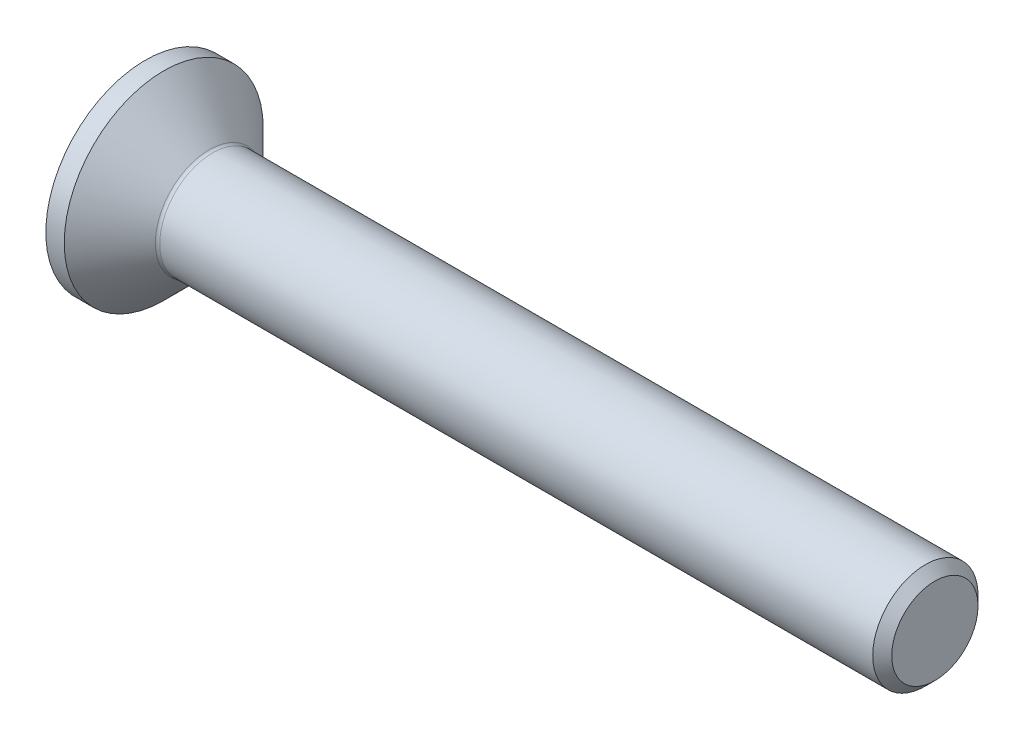
ISO-10303-21;
HEADER;
FILE_DESCRIPTION(('STEP AP214'),'2;1');
FILE_NAME('part.step','',(''),(''),'','','');
FILE_SCHEMA(('AUTOMOTIVE_DESIGN { 1 0 10303 214 1 1 1 1 }'));
ENDSEC;
DATA;
#1=APPLICATION_CONTEXT('core data for automotive mechanical design processes');
#2=APPLICATION_PROTOCOL_DEFINITION('international standard','automotive_design',2000,#1);
#3=PRODUCT_CONTEXT('',#1,'mechanical');
#4=PRODUCT('Part','Part','',(#3));
#5=PRODUCT_RELATED_PRODUCT_CATEGORY('part','',(#4));
#6=PRODUCT_DEFINITION_FORMATION('','',#4);
#7=PRODUCT_DEFINITION_CONTEXT('part definition',#1,'design');
#8=PRODUCT_DEFINITION('design','',#6,#7);
#9=PRODUCT_DEFINITION_SHAPE('','',#8);
#10=(LENGTH_UNIT() NAMED_UNIT(*) SI_UNIT(.MILLI.,.METRE.));
#11=(NAMED_UNIT(*) PLANE_ANGLE_UNIT() SI_UNIT($,.RADIAN.));
#12=(NAMED_UNIT(*) SI_UNIT($,.STERADIAN.) SOLID_ANGLE_UNIT());
#13=UNCERTAINTY_MEASURE_WITH_UNIT(LENGTH_MEASURE(1.E-05),#10,'distance_accuracy_value','');
#14=(GEOMETRIC_REPRESENTATION_CONTEXT(3) GLOBAL_UNCERTAINTY_ASSIGNED_CONTEXT((#13)) GLOBAL_UNIT_ASSIGNED_CONTEXT((#10,
#11,#12)) REPRESENTATION_CONTEXT('',''));
#15=CARTESIAN_POINT('',(0.,0.,0.));
#16=DIRECTION('',(0.,0.,1.));
#17=DIRECTION('',(1.,0.,0.));
#18=AXIS2_PLACEMENT_3D('',#15,#16,#17);
#19=CARTESIAN_POINT('',(3.72,0.,0.));
#20=DIRECTION('',(-1.,0.,0.));
#21=DIRECTION('',(0.,0.,1.));
#22=AXIS2_PLACEMENT_3D('',#19,#20,#21);
#23=CONICAL_SURFACE('',#22,3.,0.785398163397448);
#24=CARTESIAN_POINT('',(1.05,0.,0.));
#25=DIRECTION('',(-1.,0.,0.));
#26=DIRECTION('',(0.,0.,1.));
#27=AXIS2_PLACEMENT_3D('',#24,#25,#26);
#28=CIRCLE('',#27,5.67);
#29=CARTESIAN_POINT('',(1.05,0.,5.67));
#30=VERTEX_POINT('',#29);
#31=EDGE_CURVE('E43',#30,#30,#28,.F.);
#32=ORIENTED_EDGE('',*,*,#31,.T.);
#33=EDGE_LOOP('',(#32));
#34=FACE_BOUND('',#33,.T.);
#35=CARTESIAN_POINT('',(3.64677669529664,0.,0.));
#36=DIRECTION('',(-1.,0.,0.));
#37=DIRECTION('',(0.,0.,1.));
#38=AXIS2_PLACEMENT_3D('',#35,#36,#37);
#39=CIRCLE('',#38,3.07322330470336);
#40=CARTESIAN_POINT('',(3.64677669529664,0.,3.07322330470336));
#41=VERTEX_POINT('',#40);
#42=EDGE_CURVE('E162',#41,#41,#39,.T.);
#43=ORIENTED_EDGE('',*,*,#42,.T.);
#44=EDGE_LOOP('',(#43));
#45=FACE_BOUND('',#44,.T.);
#46=ADVANCED_FACE('F39',(#34,#45),#23,.T.);
#47=CARTESIAN_POINT('',(-0.587069180985524,0.,0.));
#48=DIRECTION('',(-1.,0.,0.));
#49=DIRECTION('',(0.,0.,1.));
#50=AXIS2_PLACEMENT_3D('',#47,#48,#49);
#51=CYLINDRICAL_SURFACE('',#50,3.);
#52=CARTESIAN_POINT('',(44.4585,0.,0.));
#53=DIRECTION('',(-1.,0.,0.));
#54=DIRECTION('',(0.,0.,1.));
#55=AXIS2_PLACEMENT_3D('',#52,#53,#54);
#56=CIRCLE('',#55,3.);
#57=CARTESIAN_POINT('',(44.4585,0.,3.));
#58=VERTEX_POINT('',#57);
#59=EDGE_CURVE('E48',#58,#58,#56,.T.);
#60=ORIENTED_EDGE('',*,*,#59,.T.);
#61=EDGE_LOOP('',(#60));
#62=FACE_BOUND('',#61,.T.);
#63=CARTESIAN_POINT('',(3.82355339059328,0.,0.));
#64=DIRECTION('',(-1.,0.,0.));
#65=DIRECTION('',(0.,0.,1.));
#66=AXIS2_PLACEMENT_3D('',#63,#64,#65);
#67=CIRCLE('',#66,3.);
#68=CARTESIAN_POINT('',(3.82355339059328,0.,3.));
#69=VERTEX_POINT('',#68);
#70=EDGE_CURVE('E159',#69,#69,#67,.F.);
#71=ORIENTED_EDGE('',*,*,#70,.T.);
#72=EDGE_LOOP('',(#71));
#73=FACE_BOUND('',#72,.T.);
#74=ADVANCED_FACE('F130',(#62,#73),#51,.T.);
#75=CARTESIAN_POINT('',(45.,3.,0.));
#76=DIRECTION('',(-1.,0.,0.));
#77=DIRECTION('',(0.,0.,1.));
#78=AXIS2_PLACEMENT_3D('',#75,#76,#77);
#79=PLANE('',#78);
#80=CARTESIAN_POINT('',(45.,0.,0.));
#81=DIRECTION('',(-1.,0.,0.));
#82=DIRECTION('',(0.,0.,1.));
#83=AXIS2_PLACEMENT_3D('',#80,#81,#82);
#84=CIRCLE('',#83,2.45849999999999);
#85=CARTESIAN_POINT('',(45.,0.,2.45849999999999));
#86=VERTEX_POINT('',#85);
#87=EDGE_CURVE('E11',#86,#86,#84,.F.);
#88=ORIENTED_EDGE('',*,*,#87,.T.);
#89=EDGE_LOOP('',(#88));
#90=FACE_BOUND('',#89,.T.);
#91=ADVANCED_FACE('F136',(#90),#79,.F.);
#92=CARTESIAN_POINT('',(3.82355339059328,0.,0.));
#93=DIRECTION('',(-1.,0.,0.));
#94=DIRECTION('',(0.,0.,1.));
#95=AXIS2_PLACEMENT_3D('',#92,#93,#94);
#96=TOROIDAL_SURFACE('',#95,3.25,0.25);
#97=ORIENTED_EDGE('',*,*,#70,.F.);
#98=EDGE_LOOP('',(#97));
#99=FACE_BOUND('',#98,.T.);
#100=ORIENTED_EDGE('',*,*,#42,.F.);
#101=EDGE_LOOP('',(#100));
#102=FACE_BOUND('',#101,.T.);
#103=ADVANCED_FACE('F147',(#99,#102),#96,.F.);
#104=CARTESIAN_POINT('',(44.4585,0.,0.));
#105=DIRECTION('',(-1.,0.,0.));
#106=DIRECTION('',(0.,0.,1.));
#107=AXIS2_PLACEMENT_3D('',#104,#105,#106);
#108=CONICAL_SURFACE('',#107,3.,0.785398163397444);
#109=ORIENTED_EDGE('',*,*,#87,.F.);
#110=EDGE_LOOP('',(#109));
#111=FACE_BOUND('',#110,.T.);
#112=ORIENTED_EDGE('',*,*,#59,.F.);
#113=EDGE_LOOP('',(#112));
#114=FACE_BOUND('',#113,.T.);
#115=ADVANCED_FACE('F41',(#111,#114),#108,.T.);
#116=CARTESIAN_POINT('',(11.8531386861314,0.,0.));
#117=DIRECTION('',(1.,0.,0.));
#118=DIRECTION('',(0.,0.,-1.));
#119=AXIS2_PLACEMENT_3D('',#116,#117,#118);
#120=CYLINDRICAL_SURFACE('',#119,5.67);
#121=ORIENTED_EDGE('',*,*,#31,.F.);
#122=EDGE_LOOP('',(#121));
#123=FACE_BOUND('',#122,.T.);
#124=CARTESIAN_POINT('',(0.,0.,0.));
#125=DIRECTION('',(1.,0.,0.));
#126=DIRECTION('',(0.,0.,-1.));
#127=AXIS2_PLACEMENT_3D('',#124,#125,#126);
#128=CIRCLE('',#127,5.67);
#129=CARTESIAN_POINT('',(0.,0.,-5.67));
#130=VERTEX_POINT('',#129);
#131=EDGE_CURVE('E228',#130,#130,#128,.F.);
#132=ORIENTED_EDGE('',*,*,#131,.F.);
#133=EDGE_LOOP('',(#132));
#134=FACE_BOUND('',#133,.T.);
#135=ADVANCED_FACE('F117',(#123,#134),#120,.T.);
#136=CARTESIAN_POINT('',(3.35470053837925,0.,0.));
#137=DIRECTION('',(-1.,0.,0.));
#138=DIRECTION('',(0.,0.,1.));
#139=AXIS2_PLACEMENT_3D('',#136,#137,#138);
#140=CONICAL_SURFACE('',#139,0.,1.0471975511966);
#141=CARTESIAN_POINT('',(2.2,0.,0.));
#142=DIRECTION('',(-1.,0.,0.));
#143=DIRECTION('',(0.,0.,1.));
#144=AXIS2_PLACEMENT_3D('',#141,#142,#143);
#145=CIRCLE('',#144,2.);
#146=CARTESIAN_POINT('',(2.2,1.,1.73205080756888));
#147=VERTEX_POINT('',#146);
#148=CARTESIAN_POINT('',(2.2,2.,0.));
#149=VERTEX_POINT('',#148);
#150=EDGE_CURVE('E168',#147,#149,#145,.T.);
#151=ORIENTED_EDGE('',*,*,#150,.T.);
#152=CARTESIAN_POINT('',(2.2,1.,-1.73205080756888));
#153=VERTEX_POINT('',#152);
#154=EDGE_CURVE('E163',#149,#153,#145,.T.);
#155=ORIENTED_EDGE('',*,*,#154,.T.);
#156=CARTESIAN_POINT('',(2.2,-1.,-1.73205080756888));
#157=VERTEX_POINT('',#156);
#158=EDGE_CURVE('E166',#153,#157,#145,.T.);
#159=ORIENTED_EDGE('',*,*,#158,.T.);
#160=CARTESIAN_POINT('',(2.2,-2.,0.));
#161=VERTEX_POINT('',#160);
#162=EDGE_CURVE('E247',#157,#161,#145,.T.);
#163=ORIENTED_EDGE('',*,*,#162,.T.);
#164=CARTESIAN_POINT('',(2.2,-1.,1.73205080756888));
#165=VERTEX_POINT('',#164);
#166=EDGE_CURVE('E55',#161,#165,#145,.T.);
#167=ORIENTED_EDGE('',*,*,#166,.T.);
#168=EDGE_CURVE('E177',#165,#147,#145,.T.);
#169=ORIENTED_EDGE('',*,*,#168,.T.);
#170=EDGE_LOOP('',(#151,#155,#159,#163,#167,#169));
#171=FACE_BOUND('',#170,.T.);
#172=CARTESIAN_POINT('',(3.35470053837925,0.,0.));
#173=VERTEX_POINT('',#172);
#174=VERTEX_LOOP('',#173);
#175=FACE_BOUND('',#174,.T.);
#176=ADVANCED_FACE('F114',(#171,#175),#140,.F.);
#177=CARTESIAN_POINT('',(2.2,0.,-2.3094010767585));
#178=DIRECTION('',(1.,0.,0.));
#179=DIRECTION('',(0.,0.,-1.));
#180=AXIS2_PLACEMENT_3D('',#177,#178,#179);
#181=PLANE('',#180);
#182=ORIENTED_EDGE('',*,*,#166,.F.);
#183=DIRECTION('',(0.,0.,-1.));
#184=VECTOR('',#183,1.);
#185=CARTESIAN_POINT('',(2.2,-2.,1.15470053837925));
#186=LINE('',#185,#184);
#187=CARTESIAN_POINT('',(2.2,-2.,1.15470053837925));
#188=VERTEX_POINT('',#187);
#189=EDGE_CURVE('E188',#188,#161,#186,.T.);
#190=ORIENTED_EDGE('',*,*,#189,.F.);
#191=DIRECTION('',(0.,-0.866025403784439,-0.5));
#192=VECTOR('',#191,1.);
#193=CARTESIAN_POINT('',(2.2,0.,2.3094010767585));
#194=LINE('',#193,#192);
#195=EDGE_CURVE('E212',#165,#188,#194,.T.);
#196=ORIENTED_EDGE('',*,*,#195,.F.);
#197=EDGE_LOOP('',(#182,#190,#196));
#198=FACE_BOUND('',#197,.T.);
#199=ADVANCED_FACE('F116',(#198),#181,.F.);
#200=ORIENTED_EDGE('',*,*,#168,.F.);
#201=CARTESIAN_POINT('',(2.2,0.,2.3094010767585));
#202=VERTEX_POINT('',#201);
#203=EDGE_CURVE('E209',#202,#165,#194,.T.);
#204=ORIENTED_EDGE('',*,*,#203,.F.);
#205=DIRECTION('',(0.,-0.866025403784438,0.5));
#206=VECTOR('',#205,1.);
#207=CARTESIAN_POINT('',(2.2,2.,1.15470053837925));
#208=LINE('',#207,#206);
#209=EDGE_CURVE('E216',#147,#202,#208,.T.);
#210=ORIENTED_EDGE('',*,*,#209,.F.);
#211=EDGE_LOOP('',(#200,#204,#210));
#212=FACE_BOUND('',#211,.T.);
#213=ADVANCED_FACE('F123',(#212),#181,.F.);
#214=ORIENTED_EDGE('',*,*,#150,.F.);
#215=CARTESIAN_POINT('',(2.2,2.,1.15470053837925));
#216=VERTEX_POINT('',#215);
#217=EDGE_CURVE('E213',#216,#147,#208,.T.);
#218=ORIENTED_EDGE('',*,*,#217,.F.);
#219=DIRECTION('',(0.,0.,1.));
#220=VECTOR('',#219,1.);
#221=CARTESIAN_POINT('',(2.2,2.,-1.15470053837925));
#222=LINE('',#221,#220);
#223=EDGE_CURVE('E220',#149,#216,#222,.T.);
#224=ORIENTED_EDGE('',*,*,#223,.F.);
#225=EDGE_LOOP('',(#214,#218,#224));
#226=FACE_BOUND('',#225,.T.);
#227=ADVANCED_FACE('F278',(#226),#181,.F.);
#228=ORIENTED_EDGE('',*,*,#154,.F.);
#229=CARTESIAN_POINT('',(2.2,2.,-1.15470053837925));
#230=VERTEX_POINT('',#229);
#231=EDGE_CURVE('E217',#230,#149,#222,.T.);
#232=ORIENTED_EDGE('',*,*,#231,.F.);
#233=DIRECTION('',(0.,0.866025403784438,0.5));
#234=VECTOR('',#233,1.);
#235=CARTESIAN_POINT('',(2.2,0.,-2.3094010767585));
#236=LINE('',#235,#234);
#237=EDGE_CURVE('E224',#153,#230,#236,.T.);
#238=ORIENTED_EDGE('',*,*,#237,.F.);
#239=EDGE_LOOP('',(#228,#232,#238));
#240=FACE_BOUND('',#239,.T.);
#241=ADVANCED_FACE('F283',(#240),#181,.F.);
#242=ORIENTED_EDGE('',*,*,#158,.F.);
#243=CARTESIAN_POINT('',(2.2,0.,-2.3094010767585));
#244=VERTEX_POINT('',#243);
#245=EDGE_CURVE('E221',#244,#153,#236,.T.);
#246=ORIENTED_EDGE('',*,*,#245,.F.);
#247=DIRECTION('',(0.,0.866025403784439,-0.5));
#248=VECTOR('',#247,1.);
#249=CARTESIAN_POINT('',(2.2,-2.,-1.15470053837925));
#250=LINE('',#249,#248);
#251=EDGE_CURVE('E192',#157,#244,#250,.T.);
#252=ORIENTED_EDGE('',*,*,#251,.F.);
#253=EDGE_LOOP('',(#242,#246,#252));
#254=FACE_BOUND('',#253,.T.);
#255=ADVANCED_FACE('F252',(#254),#181,.F.);
#256=ORIENTED_EDGE('',*,*,#162,.F.);
#257=CARTESIAN_POINT('',(2.2,-2.,-1.15470053837925));
#258=VERTEX_POINT('',#257);
#259=EDGE_CURVE('E225',#258,#157,#250,.T.);
#260=ORIENTED_EDGE('',*,*,#259,.F.);
#261=EDGE_CURVE('E208',#161,#258,#186,.T.);
#262=ORIENTED_EDGE('',*,*,#261,.F.);
#263=EDGE_LOOP('',(#256,#260,#262));
#264=FACE_BOUND('',#263,.T.);
#265=ADVANCED_FACE('F126',(#264),#181,.F.);
#266=CARTESIAN_POINT('',(2.2,-2.,1.15470053837925));
#267=DIRECTION('',(0.,1.,0.));
#268=DIRECTION('',(0.,0.,1.));
#269=AXIS2_PLACEMENT_3D('',#266,#267,#268);
#270=PLANE('',#269);
#271=DIRECTION('',(0.,0.,-1.));
#272=VECTOR('',#271,1.);
#273=CARTESIAN_POINT('',(0.,-2.,1.15470053837925));
#274=LINE('',#273,#272);
#275=CARTESIAN_POINT('',(0.,-2.,1.15470053837925));
#276=VERTEX_POINT('',#275);
#277=CARTESIAN_POINT('',(0.,-2.,-1.15470053837925));
#278=VERTEX_POINT('',#277);
#279=EDGE_CURVE('E189',#276,#278,#274,.T.);
#280=ORIENTED_EDGE('',*,*,#279,.F.);
#281=DIRECTION('',(-1.,0.,0.));
#282=VECTOR('',#281,1.);
#283=CARTESIAN_POINT('',(2.2,-2.,1.15470053837925));
#284=LINE('',#283,#282);
#285=EDGE_CURVE('E184',#188,#276,#284,.T.);
#286=ORIENTED_EDGE('',*,*,#285,.F.);
#287=ORIENTED_EDGE('',*,*,#189,.T.);
#288=ORIENTED_EDGE('',*,*,#261,.T.);
#289=DIRECTION('',(-1.,0.,0.));
#290=VECTOR('',#289,1.);
#291=CARTESIAN_POINT('',(2.2,-2.,-1.15470053837925));
#292=LINE('',#291,#290);
#293=EDGE_CURVE('E186',#258,#278,#292,.T.);
#294=ORIENTED_EDGE('',*,*,#293,.T.);
#295=EDGE_LOOP('',(#280,#286,#287,#288,#294));
#296=FACE_BOUND('',#295,.T.);
#297=ADVANCED_FACE('F241',(#296),#270,.T.);
#298=CARTESIAN_POINT('',(2.2,0.,2.3094010767585));
#299=DIRECTION('',(0.,0.5,-0.866025403784438));
#300=DIRECTION('',(0.,0.866025403784439,0.5));
#301=AXIS2_PLACEMENT_3D('',#298,#299,#300);
#302=PLANE('',#301);
#303=DIRECTION('',(0.,-0.866025403784439,-0.5));
#304=VECTOR('',#303,1.);
#305=CARTESIAN_POINT('',(0.,0.,2.3094010767585));
#306=LINE('',#305,#304);
#307=CARTESIAN_POINT('',(0.,0.,2.3094010767585));
#308=VERTEX_POINT('',#307);
#309=EDGE_CURVE('E193',#308,#276,#306,.T.);
#310=ORIENTED_EDGE('',*,*,#309,.F.);
#311=DIRECTION('',(-1.,0.,0.));
#312=VECTOR('',#311,1.);
#313=CARTESIAN_POINT('',(2.2,0.,2.3094010767585));
#314=LINE('',#313,#312);
#315=EDGE_CURVE('E182',#202,#308,#314,.T.);
#316=ORIENTED_EDGE('',*,*,#315,.F.);
#317=ORIENTED_EDGE('',*,*,#203,.T.);
#318=ORIENTED_EDGE('',*,*,#195,.T.);
#319=ORIENTED_EDGE('',*,*,#285,.T.);
#320=EDGE_LOOP('',(#310,#316,#317,#318,#319));
#321=FACE_BOUND('',#320,.T.);
#322=ADVANCED_FACE('F271',(#321),#302,.T.);
#323=CARTESIAN_POINT('',(2.2,2.,1.15470053837925));
#324=DIRECTION('',(0.,-0.5,-0.866025403784439));
#325=DIRECTION('',(0.,0.866025403784438,-0.5));
#326=AXIS2_PLACEMENT_3D('',#323,#324,#325);
#327=PLANE('',#326);
#328=DIRECTION('',(0.,-0.866025403784438,0.5));
#329=VECTOR('',#328,1.);
#330=CARTESIAN_POINT('',(0.,2.,1.15470053837925));
#331=LINE('',#330,#329);
#332=CARTESIAN_POINT('',(0.,2.,1.15470053837925));
#333=VERTEX_POINT('',#332);
#334=EDGE_CURVE('E196',#333,#308,#331,.T.);
#335=ORIENTED_EDGE('',*,*,#334,.F.);
#336=DIRECTION('',(-1.,0.,0.));
#337=VECTOR('',#336,1.);
#338=CARTESIAN_POINT('',(2.2,2.,1.15470053837925));
#339=LINE('',#338,#337);
#340=EDGE_CURVE('E180',#216,#333,#339,.T.);
#341=ORIENTED_EDGE('',*,*,#340,.F.);
#342=ORIENTED_EDGE('',*,*,#217,.T.);
#343=ORIENTED_EDGE('',*,*,#209,.T.);
#344=ORIENTED_EDGE('',*,*,#315,.T.);
#345=EDGE_LOOP('',(#335,#341,#342,#343,#344));
#346=FACE_BOUND('',#345,.T.);
#347=ADVANCED_FACE('F265',(#346),#327,.T.);
#348=CARTESIAN_POINT('',(2.2,2.,-1.15470053837925));
#349=DIRECTION('',(0.,-1.,0.));
#350=DIRECTION('',(0.,0.,-1.));
#351=AXIS2_PLACEMENT_3D('',#348,#349,#350);
#352=PLANE('',#351);
#353=DIRECTION('',(0.,0.,1.));
#354=VECTOR('',#353,1.);
#355=CARTESIAN_POINT('',(0.,2.,-1.15470053837925));
#356=LINE('',#355,#354);
#357=CARTESIAN_POINT('',(0.,2.,-1.15470053837925));
#358=VERTEX_POINT('',#357);
#359=EDGE_CURVE('E199',#358,#333,#356,.T.);
#360=ORIENTED_EDGE('',*,*,#359,.F.);
#361=DIRECTION('',(-1.,0.,0.));
#362=VECTOR('',#361,1.);
#363=CARTESIAN_POINT('',(2.2,2.,-1.15470053837925));
#364=LINE('',#363,#362);
#365=EDGE_CURVE('E178',#230,#358,#364,.T.);
#366=ORIENTED_EDGE('',*,*,#365,.F.);
#367=ORIENTED_EDGE('',*,*,#231,.T.);
#368=ORIENTED_EDGE('',*,*,#223,.T.);
#369=ORIENTED_EDGE('',*,*,#340,.T.);
#370=EDGE_LOOP('',(#360,#366,#367,#368,#369));
#371=FACE_BOUND('',#370,.T.);
#372=ADVANCED_FACE('F261',(#371),#352,.T.);
#373=CARTESIAN_POINT('',(2.2,0.,-2.3094010767585));
#374=DIRECTION('',(0.,-0.5,0.866025403784438));
#375=DIRECTION('',(0.,-0.866025403784438,-0.5));
#376=AXIS2_PLACEMENT_3D('',#373,#374,#375);
#377=PLANE('',#376);
#378=DIRECTION('',(0.,0.866025403784438,0.5));
#379=VECTOR('',#378,1.);
#380=CARTESIAN_POINT('',(0.,0.,-2.3094010767585));
#381=LINE('',#380,#379);
#382=CARTESIAN_POINT('',(0.,0.,-2.3094010767585));
#383=VERTEX_POINT('',#382);
#384=EDGE_CURVE('E202',#383,#358,#381,.T.);
#385=ORIENTED_EDGE('',*,*,#384,.F.);
#386=DIRECTION('',(-1.,0.,0.));
#387=VECTOR('',#386,1.);
#388=CARTESIAN_POINT('',(2.2,0.,-2.3094010767585));
#389=LINE('',#388,#387);
#390=EDGE_CURVE('E170',#244,#383,#389,.T.);
#391=ORIENTED_EDGE('',*,*,#390,.F.);
#392=ORIENTED_EDGE('',*,*,#245,.T.);
#393=ORIENTED_EDGE('',*,*,#237,.T.);
#394=ORIENTED_EDGE('',*,*,#365,.T.);
#395=EDGE_LOOP('',(#385,#391,#392,#393,#394));
#396=FACE_BOUND('',#395,.T.);
#397=ADVANCED_FACE('F256',(#396),#377,.T.);
#398=CARTESIAN_POINT('',(2.2,-2.,-1.15470053837925));
#399=DIRECTION('',(0.,0.5,0.866025403784439));
#400=DIRECTION('',(0.,-0.866025403784439,0.5));
#401=AXIS2_PLACEMENT_3D('',#398,#399,#400);
#402=PLANE('',#401);
#403=DIRECTION('',(0.,0.866025403784439,-0.5));
#404=VECTOR('',#403,1.);
#405=CARTESIAN_POINT('',(0.,-2.,-1.15470053837925));
#406=LINE('',#405,#404);
#407=EDGE_CURVE('E63',#278,#383,#406,.T.);
#408=ORIENTED_EDGE('',*,*,#407,.F.);
#409=ORIENTED_EDGE('',*,*,#293,.F.);
#410=ORIENTED_EDGE('',*,*,#259,.T.);
#411=ORIENTED_EDGE('',*,*,#251,.T.);
#412=ORIENTED_EDGE('',*,*,#390,.T.);
#413=EDGE_LOOP('',(#408,#409,#410,#411,#412));
#414=FACE_BOUND('',#413,.T.);
#415=ADVANCED_FACE('F145',(#414),#402,.T.);
#416=CARTESIAN_POINT('',(0.,0.,0.));
#417=DIRECTION('',(1.,0.,0.));
#418=DIRECTION('',(0.,0.,-1.));
#419=AXIS2_PLACEMENT_3D('',#416,#417,#418);
#420=PLANE('',#419);
#421=ORIENTED_EDGE('',*,*,#131,.T.);
#422=EDGE_LOOP('',(#421));
#423=FACE_BOUND('',#422,.T.);
#424=ORIENTED_EDGE('',*,*,#407,.T.);
#425=ORIENTED_EDGE('',*,*,#384,.T.);
#426=ORIENTED_EDGE('',*,*,#359,.T.);
#427=ORIENTED_EDGE('',*,*,#334,.T.);
#428=ORIENTED_EDGE('',*,*,#309,.T.);
#429=ORIENTED_EDGE('',*,*,#279,.T.);
#430=EDGE_LOOP('',(#424,#425,#426,#427,#428,#429));
#431=FACE_BOUND('',#430,.T.);
#432=ADVANCED_FACE('F143',(#423,#431),#420,.F.);
#433=CLOSED_SHELL('',(#46,#74,#91,#103,#115,#135,#176,#199,#213,#227,#241,#255,#265,#297,#322,
#347,#372,#397,#415,#432));
#434=MANIFOLD_SOLID_BREP('B2',#433);
#435=ADVANCED_BREP_SHAPE_REPRESENTATION('',(#18,#434),#14);
#436=SHAPE_DEFINITION_REPRESENTATION(#9,#435);
ENDSEC;
END-ISO-10303-21;
